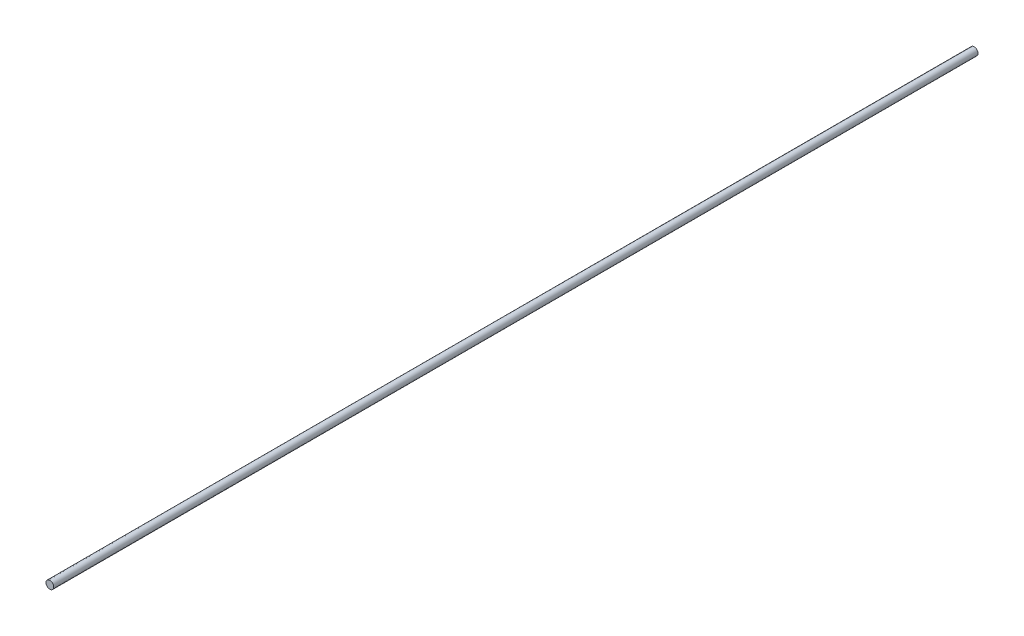
ISO-10303-21;
HEADER;
FILE_DESCRIPTION(('STEP AP214'),'2;1');
FILE_NAME('part.step','',(''),(''),'','','');
FILE_SCHEMA(('AUTOMOTIVE_DESIGN { 1 0 10303 214 1 1 1 1 }'));
ENDSEC;
DATA;
#1=APPLICATION_CONTEXT('core data for automotive mechanical design processes');
#2=APPLICATION_PROTOCOL_DEFINITION('international standard','automotive_design',2000,#1);
#3=PRODUCT_CONTEXT('',#1,'mechanical');
#4=PRODUCT('Part','Part','',(#3));
#5=PRODUCT_RELATED_PRODUCT_CATEGORY('part','',(#4));
#6=PRODUCT_DEFINITION_FORMATION('','',#4);
#7=PRODUCT_DEFINITION_CONTEXT('part definition',#1,'design');
#8=PRODUCT_DEFINITION('design','',#6,#7);
#9=PRODUCT_DEFINITION_SHAPE('','',#8);
#10=(LENGTH_UNIT() NAMED_UNIT(*) SI_UNIT(.MILLI.,.METRE.));
#11=(NAMED_UNIT(*) PLANE_ANGLE_UNIT() SI_UNIT($,.RADIAN.));
#12=(NAMED_UNIT(*) SI_UNIT($,.STERADIAN.) SOLID_ANGLE_UNIT());
#13=UNCERTAINTY_MEASURE_WITH_UNIT(LENGTH_MEASURE(1.E-05),#10,'distance_accuracy_value','');
#14=(GEOMETRIC_REPRESENTATION_CONTEXT(3) GLOBAL_UNCERTAINTY_ASSIGNED_CONTEXT((#13)) GLOBAL_UNIT_ASSIGNED_CONTEXT((#10,
#11,#12)) REPRESENTATION_CONTEXT('',''));
#15=CARTESIAN_POINT('',(0.,0.,0.));
#16=DIRECTION('',(0.,0.,1.));
#17=DIRECTION('',(1.,0.,0.));
#18=AXIS2_PLACEMENT_3D('',#15,#16,#17);
#19=CARTESIAN_POINT('',(0.,0.,960.));
#20=DIRECTION('',(0.,0.,-1.));
#21=DIRECTION('',(-1.,0.,0.));
#22=AXIS2_PLACEMENT_3D('',#19,#20,#21);
#23=CYLINDRICAL_SURFACE('',#22,4.);
#24=CARTESIAN_POINT('',(0.,0.,960.));
#25=DIRECTION('',(0.,0.,1.));
#26=DIRECTION('',(1.,0.,0.));
#27=AXIS2_PLACEMENT_3D('',#24,#25,#26);
#28=CIRCLE('',#27,4.);
#29=CARTESIAN_POINT('',(4.,0.,960.));
#30=VERTEX_POINT('',#29);
#31=EDGE_CURVE('E10',#30,#30,#28,.T.);
#32=ORIENTED_EDGE('',*,*,#31,.F.);
#33=EDGE_LOOP('',(#32));
#34=FACE_BOUND('',#33,.T.);
#35=CARTESIAN_POINT('',(0.,0.,0.));
#36=DIRECTION('',(0.,0.,1.));
#37=DIRECTION('',(1.,0.,0.));
#38=AXIS2_PLACEMENT_3D('',#35,#36,#37);
#39=CIRCLE('',#38,4.);
#40=CARTESIAN_POINT('',(4.,0.,0.));
#41=VERTEX_POINT('',#40);
#42=EDGE_CURVE('E42',#41,#41,#39,.T.);
#43=ORIENTED_EDGE('',*,*,#42,.T.);
#44=EDGE_LOOP('',(#43));
#45=FACE_BOUND('',#44,.T.);
#46=ADVANCED_FACE('F39',(#34,#45),#23,.T.);
#47=CARTESIAN_POINT('',(0.,0.,960.));
#48=DIRECTION('',(0.,0.,1.));
#49=DIRECTION('',(1.,0.,0.));
#50=AXIS2_PLACEMENT_3D('',#47,#48,#49);
#51=PLANE('',#50);
#52=ORIENTED_EDGE('',*,*,#31,.T.);
#53=EDGE_LOOP('',(#52));
#54=FACE_BOUND('',#53,.T.);
#55=ADVANCED_FACE('F54',(#54),#51,.T.);
#56=CARTESIAN_POINT('',(0.,0.,0.));
#57=DIRECTION('',(0.,0.,1.));
#58=DIRECTION('',(1.,0.,0.));
#59=AXIS2_PLACEMENT_3D('',#56,#57,#58);
#60=PLANE('',#59);
#61=ORIENTED_EDGE('',*,*,#42,.F.);
#62=EDGE_LOOP('',(#61));
#63=FACE_BOUND('',#62,.T.);
#64=ADVANCED_FACE('F52',(#63),#60,.F.);
#65=CLOSED_SHELL('',(#46,#55,#64));
#66=MANIFOLD_SOLID_BREP('B2',#65);
#67=ADVANCED_BREP_SHAPE_REPRESENTATION('',(#18,#66),#14);
#68=SHAPE_DEFINITION_REPRESENTATION(#9,#67);
ENDSEC;
END-ISO-10303-21;
